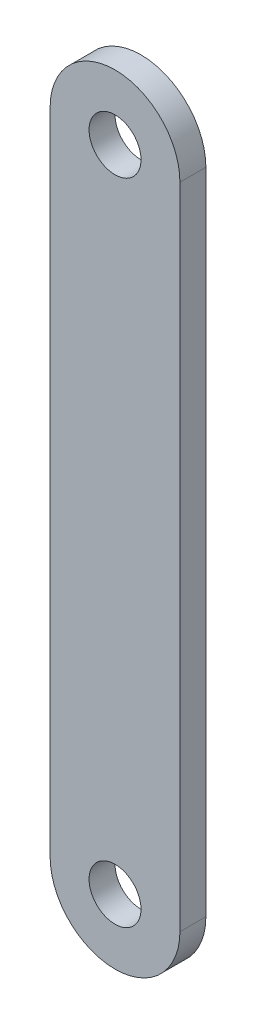
ISO-10303-21;
HEADER;
FILE_DESCRIPTION(('STEP AP214'),'2;1');
FILE_NAME('part.step','',(''),(''),'','','');
FILE_SCHEMA(('AUTOMOTIVE_DESIGN { 1 0 10303 214 1 1 1 1 }'));
ENDSEC;
DATA;
#1=APPLICATION_CONTEXT('core data for automotive mechanical design processes');
#2=APPLICATION_PROTOCOL_DEFINITION('international standard','automotive_design',2000,#1);
#3=PRODUCT_CONTEXT('',#1,'mechanical');
#4=PRODUCT('Part','Part','',(#3));
#5=PRODUCT_RELATED_PRODUCT_CATEGORY('part','',(#4));
#6=PRODUCT_DEFINITION_FORMATION('','',#4);
#7=PRODUCT_DEFINITION_CONTEXT('part definition',#1,'design');
#8=PRODUCT_DEFINITION('design','',#6,#7);
#9=PRODUCT_DEFINITION_SHAPE('','',#8);
#10=(LENGTH_UNIT() NAMED_UNIT(*) SI_UNIT(.MILLI.,.METRE.));
#11=(NAMED_UNIT(*) PLANE_ANGLE_UNIT() SI_UNIT($,.RADIAN.));
#12=(NAMED_UNIT(*) SI_UNIT($,.STERADIAN.) SOLID_ANGLE_UNIT());
#13=UNCERTAINTY_MEASURE_WITH_UNIT(LENGTH_MEASURE(1.E-05),#10,'distance_accuracy_value','');
#14=(GEOMETRIC_REPRESENTATION_CONTEXT(3) GLOBAL_UNCERTAINTY_ASSIGNED_CONTEXT((#13)) GLOBAL_UNIT_ASSIGNED_CONTEXT((#10,
#11,#12)) REPRESENTATION_CONTEXT('',''));
#15=CARTESIAN_POINT('',(0.,0.,0.));
#16=DIRECTION('',(0.,0.,1.));
#17=DIRECTION('',(1.,0.,0.));
#18=AXIS2_PLACEMENT_3D('',#15,#16,#17);
#19=CARTESIAN_POINT('',(25.,0.,10.));
#20=DIRECTION('',(0.,0.,1.));
#21=DIRECTION('',(1.,0.,0.));
#22=AXIS2_PLACEMENT_3D('',#19,#20,#21);
#23=PLANE('',#22);
#24=CARTESIAN_POINT('',(25.,250.,10.));
#25=DIRECTION('',(0.,0.,1.));
#26=DIRECTION('',(1.,0.,0.));
#27=AXIS2_PLACEMENT_3D('',#24,#25,#26);
#28=CIRCLE('',#27,10.);
#29=CARTESIAN_POINT('',(35.,250.,10.));
#30=VERTEX_POINT('',#29);
#31=EDGE_CURVE('E100',#30,#30,#28,.T.);
#32=ORIENTED_EDGE('',*,*,#31,.F.);
#33=EDGE_LOOP('',(#32));
#34=FACE_BOUND('',#33,.T.);
#35=CARTESIAN_POINT('',(25.,0.,10.));
#36=DIRECTION('',(0.,0.,1.));
#37=DIRECTION('',(1.,0.,0.));
#38=AXIS2_PLACEMENT_3D('',#35,#36,#37);
#39=CIRCLE('',#38,25.);
#40=CARTESIAN_POINT('',(0.,0.,10.));
#41=VERTEX_POINT('',#40);
#42=CARTESIAN_POINT('',(50.,0.,10.));
#43=VERTEX_POINT('',#42);
#44=EDGE_CURVE('E85',#41,#43,#39,.T.);
#45=ORIENTED_EDGE('',*,*,#44,.T.);
#46=DIRECTION('',(0.,1.,0.));
#47=VECTOR('',#46,1.);
#48=CARTESIAN_POINT('',(50.,0.,10.));
#49=LINE('',#48,#47);
#50=CARTESIAN_POINT('',(50.,250.,10.));
#51=VERTEX_POINT('',#50);
#52=EDGE_CURVE('E80',#43,#51,#49,.T.);
#53=ORIENTED_EDGE('',*,*,#52,.T.);
#54=CARTESIAN_POINT('',(25.,250.,10.));
#55=DIRECTION('',(0.,0.,1.));
#56=DIRECTION('',(1.,0.,0.));
#57=AXIS2_PLACEMENT_3D('',#54,#55,#56);
#58=CIRCLE('',#57,25.);
#59=CARTESIAN_POINT('',(0.,250.,10.));
#60=VERTEX_POINT('',#59);
#61=EDGE_CURVE('E83',#51,#60,#58,.T.);
#62=ORIENTED_EDGE('',*,*,#61,.T.);
#63=DIRECTION('',(0.,-1.,0.));
#64=VECTOR('',#63,1.);
#65=CARTESIAN_POINT('',(0.,250.,10.));
#66=LINE('',#65,#64);
#67=EDGE_CURVE('E50',#60,#41,#66,.T.);
#68=ORIENTED_EDGE('',*,*,#67,.T.);
#69=EDGE_LOOP('',(#45,#53,#62,#68));
#70=FACE_BOUND('',#69,.T.);
#71=CARTESIAN_POINT('',(25.,0.,10.));
#72=DIRECTION('',(0.,0.,1.));
#73=DIRECTION('',(1.,0.,0.));
#74=AXIS2_PLACEMENT_3D('',#71,#72,#73);
#75=CIRCLE('',#74,10.);
#76=CARTESIAN_POINT('',(35.,0.,10.));
#77=VERTEX_POINT('',#76);
#78=EDGE_CURVE('E115',#77,#77,#75,.T.);
#79=ORIENTED_EDGE('',*,*,#78,.F.);
#80=EDGE_LOOP('',(#79));
#81=FACE_BOUND('',#80,.T.);
#82=ADVANCED_FACE('F33',(#34,#70,#81),#23,.T.);
#83=CARTESIAN_POINT('',(25.,0.,0.));
#84=DIRECTION('',(0.,0.,1.));
#85=DIRECTION('',(1.,0.,0.));
#86=AXIS2_PLACEMENT_3D('',#83,#84,#85);
#87=PLANE('',#86);
#88=CARTESIAN_POINT('',(25.,250.,0.));
#89=DIRECTION('',(0.,0.,1.));
#90=DIRECTION('',(1.,0.,0.));
#91=AXIS2_PLACEMENT_3D('',#88,#89,#90);
#92=CIRCLE('',#91,10.);
#93=CARTESIAN_POINT('',(35.,250.,0.));
#94=VERTEX_POINT('',#93);
#95=EDGE_CURVE('E112',#94,#94,#92,.T.);
#96=ORIENTED_EDGE('',*,*,#95,.T.);
#97=EDGE_LOOP('',(#96));
#98=FACE_BOUND('',#97,.T.);
#99=CARTESIAN_POINT('',(25.,0.,0.));
#100=DIRECTION('',(0.,0.,1.));
#101=DIRECTION('',(1.,0.,0.));
#102=AXIS2_PLACEMENT_3D('',#99,#100,#101);
#103=CIRCLE('',#102,25.);
#104=CARTESIAN_POINT('',(0.,0.,0.));
#105=VERTEX_POINT('',#104);
#106=CARTESIAN_POINT('',(50.,0.,0.));
#107=VERTEX_POINT('',#106);
#108=EDGE_CURVE('E97',#105,#107,#103,.T.);
#109=ORIENTED_EDGE('',*,*,#108,.F.);
#110=DIRECTION('',(0.,-1.,0.));
#111=VECTOR('',#110,1.);
#112=CARTESIAN_POINT('',(0.,250.,0.));
#113=LINE('',#112,#111);
#114=CARTESIAN_POINT('',(0.,250.,0.));
#115=VERTEX_POINT('',#114);
#116=EDGE_CURVE('E73',#115,#105,#113,.T.);
#117=ORIENTED_EDGE('',*,*,#116,.F.);
#118=CARTESIAN_POINT('',(25.,250.,0.));
#119=DIRECTION('',(0.,0.,1.));
#120=DIRECTION('',(1.,0.,0.));
#121=AXIS2_PLACEMENT_3D('',#118,#119,#120);
#122=CIRCLE('',#121,25.);
#123=CARTESIAN_POINT('',(50.,250.,0.));
#124=VERTEX_POINT('',#123);
#125=EDGE_CURVE('E67',#124,#115,#122,.T.);
#126=ORIENTED_EDGE('',*,*,#125,.F.);
#127=DIRECTION('',(0.,1.,0.));
#128=VECTOR('',#127,1.);
#129=CARTESIAN_POINT('',(50.,0.,0.));
#130=LINE('',#129,#128);
#131=EDGE_CURVE('E89',#107,#124,#130,.T.);
#132=ORIENTED_EDGE('',*,*,#131,.F.);
#133=EDGE_LOOP('',(#109,#117,#126,#132));
#134=FACE_BOUND('',#133,.T.);
#135=CARTESIAN_POINT('',(25.,0.,0.));
#136=DIRECTION('',(0.,0.,1.));
#137=DIRECTION('',(1.,0.,0.));
#138=AXIS2_PLACEMENT_3D('',#135,#136,#137);
#139=CIRCLE('',#138,10.);
#140=CARTESIAN_POINT('',(35.,0.,0.));
#141=VERTEX_POINT('',#140);
#142=EDGE_CURVE('E118',#141,#141,#139,.T.);
#143=ORIENTED_EDGE('',*,*,#142,.T.);
#144=EDGE_LOOP('',(#143));
#145=FACE_BOUND('',#144,.T.);
#146=ADVANCED_FACE('F108',(#98,#134,#145),#87,.F.);
#147=CARTESIAN_POINT('',(25.,0.,10.));
#148=DIRECTION('',(0.,0.,-1.));
#149=DIRECTION('',(-1.,0.,0.));
#150=AXIS2_PLACEMENT_3D('',#147,#148,#149);
#151=CYLINDRICAL_SURFACE('',#150,25.);
#152=ORIENTED_EDGE('',*,*,#108,.T.);
#153=DIRECTION('',(0.,0.,-1.));
#154=VECTOR('',#153,1.);
#155=CARTESIAN_POINT('',(50.,0.,10.));
#156=LINE('',#155,#154);
#157=EDGE_CURVE('E11',#43,#107,#156,.T.);
#158=ORIENTED_EDGE('',*,*,#157,.F.);
#159=ORIENTED_EDGE('',*,*,#44,.F.);
#160=DIRECTION('',(0.,0.,-1.));
#161=VECTOR('',#160,1.);
#162=CARTESIAN_POINT('',(0.,0.,10.));
#163=LINE('',#162,#161);
#164=EDGE_CURVE('E93',#41,#105,#163,.T.);
#165=ORIENTED_EDGE('',*,*,#164,.T.);
#166=EDGE_LOOP('',(#152,#158,#159,#165));
#167=FACE_BOUND('',#166,.T.);
#168=ADVANCED_FACE('F35',(#167),#151,.T.);
#169=CARTESIAN_POINT('',(50.,0.,10.));
#170=DIRECTION('',(-1.,0.,0.));
#171=DIRECTION('',(0.,-1.,0.));
#172=AXIS2_PLACEMENT_3D('',#169,#170,#171);
#173=PLANE('',#172);
#174=ORIENTED_EDGE('',*,*,#131,.T.);
#175=DIRECTION('',(0.,0.,-1.));
#176=VECTOR('',#175,1.);
#177=CARTESIAN_POINT('',(50.,250.,10.));
#178=LINE('',#177,#176);
#179=EDGE_CURVE('E42',#51,#124,#178,.T.);
#180=ORIENTED_EDGE('',*,*,#179,.F.);
#181=ORIENTED_EDGE('',*,*,#52,.F.);
#182=ORIENTED_EDGE('',*,*,#157,.T.);
#183=EDGE_LOOP('',(#174,#180,#181,#182));
#184=FACE_BOUND('',#183,.T.);
#185=ADVANCED_FACE('F88',(#184),#173,.F.);
#186=CARTESIAN_POINT('',(25.,250.,10.));
#187=DIRECTION('',(0.,0.,-1.));
#188=DIRECTION('',(-1.,0.,0.));
#189=AXIS2_PLACEMENT_3D('',#186,#187,#188);
#190=CYLINDRICAL_SURFACE('',#189,25.);
#191=ORIENTED_EDGE('',*,*,#125,.T.);
#192=DIRECTION('',(0.,0.,-1.));
#193=VECTOR('',#192,1.);
#194=CARTESIAN_POINT('',(0.,250.,10.));
#195=LINE('',#194,#193);
#196=EDGE_CURVE('E90',#60,#115,#195,.T.);
#197=ORIENTED_EDGE('',*,*,#196,.F.);
#198=ORIENTED_EDGE('',*,*,#61,.F.);
#199=ORIENTED_EDGE('',*,*,#179,.T.);
#200=EDGE_LOOP('',(#191,#197,#198,#199));
#201=FACE_BOUND('',#200,.T.);
#202=ADVANCED_FACE('F91',(#201),#190,.T.);
#203=CARTESIAN_POINT('',(0.,250.,10.));
#204=DIRECTION('',(1.,0.,0.));
#205=DIRECTION('',(0.,1.,0.));
#206=AXIS2_PLACEMENT_3D('',#203,#204,#205);
#207=PLANE('',#206);
#208=ORIENTED_EDGE('',*,*,#116,.T.);
#209=ORIENTED_EDGE('',*,*,#164,.F.);
#210=ORIENTED_EDGE('',*,*,#67,.F.);
#211=ORIENTED_EDGE('',*,*,#196,.T.);
#212=EDGE_LOOP('',(#208,#209,#210,#211));
#213=FACE_BOUND('',#212,.T.);
#214=ADVANCED_FACE('F105',(#213),#207,.F.);
#215=CARTESIAN_POINT('',(25.,250.,10.));
#216=DIRECTION('',(0.,0.,-1.));
#217=DIRECTION('',(-1.,0.,0.));
#218=AXIS2_PLACEMENT_3D('',#215,#216,#217);
#219=CYLINDRICAL_SURFACE('',#218,10.);
#220=ORIENTED_EDGE('',*,*,#31,.T.);
#221=EDGE_LOOP('',(#220));
#222=FACE_BOUND('',#221,.T.);
#223=ORIENTED_EDGE('',*,*,#95,.F.);
#224=EDGE_LOOP('',(#223));
#225=FACE_BOUND('',#224,.T.);
#226=ADVANCED_FACE('F136',(#222,#225),#219,.F.);
#227=CARTESIAN_POINT('',(25.,0.,10.));
#228=DIRECTION('',(0.,0.,-1.));
#229=DIRECTION('',(-1.,0.,0.));
#230=AXIS2_PLACEMENT_3D('',#227,#228,#229);
#231=CYLINDRICAL_SURFACE('',#230,10.);
#232=ORIENTED_EDGE('',*,*,#78,.T.);
#233=EDGE_LOOP('',(#232));
#234=FACE_BOUND('',#233,.T.);
#235=ORIENTED_EDGE('',*,*,#142,.F.);
#236=EDGE_LOOP('',(#235));
#237=FACE_BOUND('',#236,.T.);
#238=ADVANCED_FACE('F124',(#234,#237),#231,.F.);
#239=CLOSED_SHELL('',(#82,#146,#168,#185,#202,#214,#226,#238));
#240=MANIFOLD_SOLID_BREP('B2',#239);
#241=ADVANCED_BREP_SHAPE_REPRESENTATION('',(#18,#240),#14);
#242=SHAPE_DEFINITION_REPRESENTATION(#9,#241);
ENDSEC;
END-ISO-10303-21;
